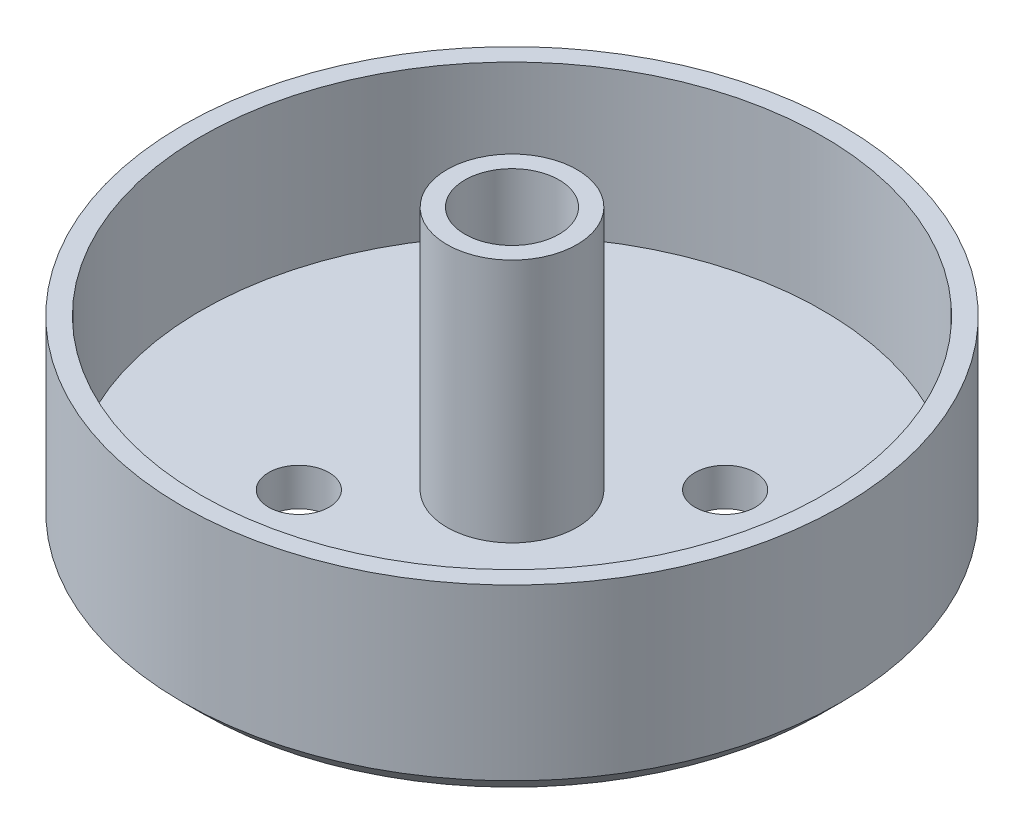
ISO-10303-21;
HEADER;
FILE_DESCRIPTION(('STEP AP214'),'2;1');
FILE_NAME('part.step','',(''),(''),'','','');
FILE_SCHEMA(('AUTOMOTIVE_DESIGN { 1 0 10303 214 1 1 1 1 }'));
ENDSEC;
DATA;
#1=APPLICATION_CONTEXT('core data for automotive mechanical design processes');
#2=APPLICATION_PROTOCOL_DEFINITION('international standard','automotive_design',2000,#1);
#3=PRODUCT_CONTEXT('',#1,'mechanical');
#4=PRODUCT('Part','Part','',(#3));
#5=PRODUCT_RELATED_PRODUCT_CATEGORY('part','',(#4));
#6=PRODUCT_DEFINITION_FORMATION('','',#4);
#7=PRODUCT_DEFINITION_CONTEXT('part definition',#1,'design');
#8=PRODUCT_DEFINITION('design','',#6,#7);
#9=PRODUCT_DEFINITION_SHAPE('','',#8);
#10=(LENGTH_UNIT() NAMED_UNIT(*) SI_UNIT(.MILLI.,.METRE.));
#11=(NAMED_UNIT(*) PLANE_ANGLE_UNIT() SI_UNIT($,.RADIAN.));
#12=(NAMED_UNIT(*) SI_UNIT($,.STERADIAN.) SOLID_ANGLE_UNIT());
#13=UNCERTAINTY_MEASURE_WITH_UNIT(LENGTH_MEASURE(1.E-05),#10,'distance_accuracy_value','');
#14=(GEOMETRIC_REPRESENTATION_CONTEXT(3) GLOBAL_UNCERTAINTY_ASSIGNED_CONTEXT((#13)) GLOBAL_UNIT_ASSIGNED_CONTEXT((#10,
#11,#12)) REPRESENTATION_CONTEXT('',''));
#15=CARTESIAN_POINT('',(0.,0.,0.));
#16=DIRECTION('',(0.,0.,1.));
#17=DIRECTION('',(1.,0.,0.));
#18=AXIS2_PLACEMENT_3D('',#15,#16,#17);
#19=CARTESIAN_POINT('',(0.,2.,0.));
#20=DIRECTION('',(0.,1.,0.));
#21=DIRECTION('',(0.,0.,1.));
#22=AXIS2_PLACEMENT_3D('',#19,#20,#21);
#23=PLANE('',#22);
#24=CARTESIAN_POINT('',(-5.6568542494924,2.,-5.65685424949235));
#25=DIRECTION('',(0.,1.,0.));
#26=DIRECTION('',(0.,0.,1.));
#27=AXIS2_PLACEMENT_3D('',#24,#25,#26);
#28=CIRCLE('',#27,1.6);
#29=CARTESIAN_POINT('',(-5.6568542494924,2.,-4.05685424949235));
#30=VERTEX_POINT('',#29);
#31=EDGE_CURVE('E77',#30,#30,#28,.T.);
#32=ORIENTED_EDGE('',*,*,#31,.F.);
#33=EDGE_LOOP('',(#32));
#34=FACE_BOUND('',#33,.T.);
#35=CARTESIAN_POINT('',(5.65685424949235,2.,-5.65685424949241));
#36=DIRECTION('',(0.,1.,0.));
#37=DIRECTION('',(0.,0.,1.));
#38=AXIS2_PLACEMENT_3D('',#35,#36,#37);
#39=CIRCLE('',#38,1.6);
#40=CARTESIAN_POINT('',(5.65685424949235,2.,-4.05685424949241));
#41=VERTEX_POINT('',#40);
#42=EDGE_CURVE('E82',#41,#41,#39,.T.);
#43=ORIENTED_EDGE('',*,*,#42,.F.);
#44=EDGE_LOOP('',(#43));
#45=FACE_BOUND('',#44,.T.);
#46=CARTESIAN_POINT('',(5.65685424949241,2.,5.65685424949235));
#47=DIRECTION('',(0.,1.,0.));
#48=DIRECTION('',(0.,0.,1.));
#49=AXIS2_PLACEMENT_3D('',#46,#47,#48);
#50=CIRCLE('',#49,1.6);
#51=CARTESIAN_POINT('',(5.65685424949241,2.,7.25685424949235));
#52=VERTEX_POINT('',#51);
#53=EDGE_CURVE('E85',#52,#52,#50,.T.);
#54=ORIENTED_EDGE('',*,*,#53,.F.);
#55=EDGE_LOOP('',(#54));
#56=FACE_BOUND('',#55,.T.);
#57=CARTESIAN_POINT('',(-5.65685424949235,2.,5.65685424949241));
#58=DIRECTION('',(0.,1.,0.));
#59=DIRECTION('',(0.,0.,1.));
#60=AXIS2_PLACEMENT_3D('',#57,#58,#59);
#61=CIRCLE('',#60,1.6);
#62=CARTESIAN_POINT('',(-5.65685424949235,2.,7.25685424949241));
#63=VERTEX_POINT('',#62);
#64=EDGE_CURVE('E88',#63,#63,#61,.T.);
#65=ORIENTED_EDGE('',*,*,#64,.F.);
#66=EDGE_LOOP('',(#65));
#67=FACE_BOUND('',#66,.T.);
#68=CARTESIAN_POINT('',(0.,2.,0.));
#69=DIRECTION('',(0.,1.,0.));
#70=DIRECTION('',(0.,0.,1.));
#71=AXIS2_PLACEMENT_3D('',#68,#69,#70);
#72=CIRCLE('',#71,3.45);
#73=CARTESIAN_POINT('',(0.,2.,3.45));
#74=VERTEX_POINT('',#73);
#75=EDGE_CURVE('E68',#74,#74,#72,.T.);
#76=ORIENTED_EDGE('',*,*,#75,.F.);
#77=EDGE_LOOP('',(#76));
#78=FACE_BOUND('',#77,.T.);
#79=CARTESIAN_POINT('',(0.,2.,0.));
#80=DIRECTION('',(0.,1.,0.));
#81=DIRECTION('',(0.,0.,1.));
#82=AXIS2_PLACEMENT_3D('',#79,#80,#81);
#83=CIRCLE('',#82,16.5);
#84=CARTESIAN_POINT('',(0.,2.,16.5));
#85=VERTEX_POINT('',#84);
#86=EDGE_CURVE('E55',#85,#85,#83,.F.);
#87=ORIENTED_EDGE('',*,*,#86,.F.);
#88=EDGE_LOOP('',(#87));
#89=FACE_BOUND('',#88,.T.);
#90=ADVANCED_FACE('F43',(#34,#45,#56,#67,#78,#89),#23,.T.);
#91=CARTESIAN_POINT('',(0.,0.,0.));
#92=DIRECTION('',(0.,1.,0.));
#93=DIRECTION('',(0.,0.,1.));
#94=AXIS2_PLACEMENT_3D('',#91,#92,#93);
#95=PLANE('',#94);
#96=CARTESIAN_POINT('',(0.,0.,0.));
#97=DIRECTION('',(0.,1.,0.));
#98=DIRECTION('',(0.,0.,1.));
#99=AXIS2_PLACEMENT_3D('',#96,#97,#98);
#100=CIRCLE('',#99,16.5);
#101=CARTESIAN_POINT('',(0.,0.,16.5));
#102=VERTEX_POINT('',#101);
#103=EDGE_CURVE('E11',#102,#102,#100,.F.);
#104=ORIENTED_EDGE('',*,*,#103,.T.);
#105=EDGE_LOOP('',(#104));
#106=FACE_BOUND('',#105,.T.);
#107=CARTESIAN_POINT('',(-5.6568542494924,0.,-5.65685424949235));
#108=DIRECTION('',(0.,-1.,0.));
#109=DIRECTION('',(0.,0.,-1.));
#110=AXIS2_PLACEMENT_3D('',#107,#108,#109);
#111=CIRCLE('',#110,1.6);
#112=CARTESIAN_POINT('',(-5.6568542494924,0.,-7.25685424949235));
#113=VERTEX_POINT('',#112);
#114=EDGE_CURVE('E95',#113,#113,#111,.T.);
#115=ORIENTED_EDGE('',*,*,#114,.F.);
#116=EDGE_LOOP('',(#115));
#117=FACE_BOUND('',#116,.T.);
#118=CARTESIAN_POINT('',(5.65685424949235,0.,-5.65685424949241));
#119=DIRECTION('',(0.,-1.,0.));
#120=DIRECTION('',(0.,0.,-1.));
#121=AXIS2_PLACEMENT_3D('',#118,#119,#120);
#122=CIRCLE('',#121,1.6);
#123=CARTESIAN_POINT('',(5.65685424949235,0.,-7.25685424949241));
#124=VERTEX_POINT('',#123);
#125=EDGE_CURVE('E98',#124,#124,#122,.T.);
#126=ORIENTED_EDGE('',*,*,#125,.F.);
#127=EDGE_LOOP('',(#126));
#128=FACE_BOUND('',#127,.T.);
#129=CARTESIAN_POINT('',(5.65685424949241,0.,5.65685424949235));
#130=DIRECTION('',(0.,-1.,0.));
#131=DIRECTION('',(0.,0.,-1.));
#132=AXIS2_PLACEMENT_3D('',#129,#130,#131);
#133=CIRCLE('',#132,1.6);
#134=CARTESIAN_POINT('',(5.65685424949241,0.,4.05685424949235));
#135=VERTEX_POINT('',#134);
#136=EDGE_CURVE('E94',#135,#135,#133,.T.);
#137=ORIENTED_EDGE('',*,*,#136,.F.);
#138=EDGE_LOOP('',(#137));
#139=FACE_BOUND('',#138,.T.);
#140=CARTESIAN_POINT('',(-5.65685424949235,0.,5.65685424949241));
#141=DIRECTION('',(0.,-1.,0.));
#142=DIRECTION('',(0.,0.,-1.));
#143=AXIS2_PLACEMENT_3D('',#140,#141,#142);
#144=CIRCLE('',#143,1.6);
#145=CARTESIAN_POINT('',(-5.65685424949235,0.,4.05685424949241));
#146=VERTEX_POINT('',#145);
#147=EDGE_CURVE('E91',#146,#146,#144,.T.);
#148=ORIENTED_EDGE('',*,*,#147,.F.);
#149=EDGE_LOOP('',(#148));
#150=FACE_BOUND('',#149,.T.);
#151=CARTESIAN_POINT('',(0.,0.,0.));
#152=DIRECTION('',(0.,1.,0.));
#153=DIRECTION('',(0.,0.,1.));
#154=AXIS2_PLACEMENT_3D('',#151,#152,#153);
#155=CIRCLE('',#154,2.5);
#156=CARTESIAN_POINT('',(0.,0.,2.5));
#157=VERTEX_POINT('',#156);
#158=EDGE_CURVE('E59',#157,#157,#155,.T.);
#159=ORIENTED_EDGE('',*,*,#158,.T.);
#160=EDGE_LOOP('',(#159));
#161=FACE_BOUND('',#160,.T.);
#162=ADVANCED_FACE('F106',(#106,#117,#128,#139,#150,#161),#95,.F.);
#163=CARTESIAN_POINT('',(0.,2.,0.));
#164=DIRECTION('',(0.,-1.,0.));
#165=DIRECTION('',(0.,0.,-1.));
#166=AXIS2_PLACEMENT_3D('',#163,#164,#165);
#167=CYLINDRICAL_SURFACE('',#166,17.5);
#168=CARTESIAN_POINT('',(0.,1.00000000000001,0.));
#169=DIRECTION('',(0.,1.,0.));
#170=DIRECTION('',(0.,0.,1.));
#171=AXIS2_PLACEMENT_3D('',#168,#169,#170);
#172=CIRCLE('',#171,17.5);
#173=CARTESIAN_POINT('',(0.,1.00000000000001,17.5));
#174=VERTEX_POINT('',#173);
#175=EDGE_CURVE('E51',#174,#174,#172,.T.);
#176=ORIENTED_EDGE('',*,*,#175,.T.);
#177=EDGE_LOOP('',(#176));
#178=FACE_BOUND('',#177,.T.);
#179=CARTESIAN_POINT('',(0.,10.,0.));
#180=DIRECTION('',(0.,1.,0.));
#181=DIRECTION('',(0.,0.,1.));
#182=AXIS2_PLACEMENT_3D('',#179,#180,#181);
#183=CIRCLE('',#182,17.5);
#184=CARTESIAN_POINT('',(0.,10.,17.5));
#185=VERTEX_POINT('',#184);
#186=EDGE_CURVE('E69',#185,#185,#183,.T.);
#187=ORIENTED_EDGE('',*,*,#186,.F.);
#188=EDGE_LOOP('',(#187));
#189=FACE_BOUND('',#188,.T.);
#190=ADVANCED_FACE('F109',(#178,#189),#167,.T.);
#191=CARTESIAN_POINT('',(0.,2.,0.));
#192=DIRECTION('',(0.,-1.,0.));
#193=DIRECTION('',(0.,0.,-1.));
#194=AXIS2_PLACEMENT_3D('',#191,#192,#193);
#195=CYLINDRICAL_SURFACE('',#194,2.5);
#196=ORIENTED_EDGE('',*,*,#158,.F.);
#197=EDGE_LOOP('',(#196));
#198=FACE_BOUND('',#197,.T.);
#199=CARTESIAN_POINT('',(0.,15.,0.));
#200=DIRECTION('',(0.,1.,0.));
#201=DIRECTION('',(0.,0.,1.));
#202=AXIS2_PLACEMENT_3D('',#199,#200,#201);
#203=CIRCLE('',#202,2.5);
#204=CARTESIAN_POINT('',(0.,15.,2.5));
#205=VERTEX_POINT('',#204);
#206=EDGE_CURVE('E65',#205,#205,#203,.T.);
#207=ORIENTED_EDGE('',*,*,#206,.T.);
#208=EDGE_LOOP('',(#207));
#209=FACE_BOUND('',#208,.T.);
#210=ADVANCED_FACE('F115',(#198,#209),#195,.F.);
#211=CARTESIAN_POINT('',(0.,39.7580735803744,0.));
#212=DIRECTION('',(0.,-1.,0.));
#213=DIRECTION('',(0.,0.,-1.));
#214=AXIS2_PLACEMENT_3D('',#211,#212,#213);
#215=CYLINDRICAL_SURFACE('',#214,3.45);
#216=ORIENTED_EDGE('',*,*,#75,.T.);
#217=EDGE_LOOP('',(#216));
#218=FACE_BOUND('',#217,.T.);
#219=CARTESIAN_POINT('',(0.,15.,0.));
#220=DIRECTION('',(0.,1.,0.));
#221=DIRECTION('',(0.,0.,1.));
#222=AXIS2_PLACEMENT_3D('',#219,#220,#221);
#223=CIRCLE('',#222,3.45);
#224=CARTESIAN_POINT('',(0.,15.,3.45));
#225=VERTEX_POINT('',#224);
#226=EDGE_CURVE('E64',#225,#225,#223,.T.);
#227=ORIENTED_EDGE('',*,*,#226,.F.);
#228=EDGE_LOOP('',(#227));
#229=FACE_BOUND('',#228,.T.);
#230=ADVANCED_FACE('F118',(#218,#229),#215,.T.);
#231=CARTESIAN_POINT('',(0.,15.,0.));
#232=DIRECTION('',(0.,1.,0.));
#233=DIRECTION('',(0.,0.,1.));
#234=AXIS2_PLACEMENT_3D('',#231,#232,#233);
#235=PLANE('',#234);
#236=ORIENTED_EDGE('',*,*,#206,.F.);
#237=EDGE_LOOP('',(#236));
#238=FACE_BOUND('',#237,.T.);
#239=ORIENTED_EDGE('',*,*,#226,.T.);
#240=EDGE_LOOP('',(#239));
#241=FACE_BOUND('',#240,.T.);
#242=ADVANCED_FACE('F122',(#238,#241),#235,.T.);
#243=CARTESIAN_POINT('',(0.,69.4974746830583,0.));
#244=DIRECTION('',(0.,-1.,0.));
#245=DIRECTION('',(0.,0.,-1.));
#246=AXIS2_PLACEMENT_3D('',#243,#244,#245);
#247=CYLINDRICAL_SURFACE('',#246,16.5);
#248=ORIENTED_EDGE('',*,*,#86,.T.);
#249=EDGE_LOOP('',(#248));
#250=FACE_BOUND('',#249,.T.);
#251=CARTESIAN_POINT('',(0.,10.,0.));
#252=DIRECTION('',(0.,1.,0.));
#253=DIRECTION('',(0.,0.,1.));
#254=AXIS2_PLACEMENT_3D('',#251,#252,#253);
#255=CIRCLE('',#254,16.5);
#256=CARTESIAN_POINT('',(0.,10.,16.5));
#257=VERTEX_POINT('',#256);
#258=EDGE_CURVE('E74',#257,#257,#255,.T.);
#259=ORIENTED_EDGE('',*,*,#258,.T.);
#260=EDGE_LOOP('',(#259));
#261=FACE_BOUND('',#260,.T.);
#262=ADVANCED_FACE('F125',(#250,#261),#247,.F.);
#263=CARTESIAN_POINT('',(0.,10.,0.));
#264=DIRECTION('',(0.,1.,0.));
#265=DIRECTION('',(0.,0.,1.));
#266=AXIS2_PLACEMENT_3D('',#263,#264,#265);
#267=PLANE('',#266);
#268=ORIENTED_EDGE('',*,*,#258,.F.);
#269=EDGE_LOOP('',(#268));
#270=FACE_BOUND('',#269,.T.);
#271=ORIENTED_EDGE('',*,*,#186,.T.);
#272=EDGE_LOOP('',(#271));
#273=FACE_BOUND('',#272,.T.);
#274=ADVANCED_FACE('F150',(#270,#273),#267,.T.);
#275=CARTESIAN_POINT('',(-5.65685424949235,3.,5.65685424949241));
#276=DIRECTION('',(0.,-1.,0.));
#277=DIRECTION('',(0.,0.,-1.));
#278=AXIS2_PLACEMENT_3D('',#275,#276,#277);
#279=CYLINDRICAL_SURFACE('',#278,1.6);
#280=ORIENTED_EDGE('',*,*,#64,.T.);
#281=EDGE_LOOP('',(#280));
#282=FACE_BOUND('',#281,.T.);
#283=ORIENTED_EDGE('',*,*,#147,.T.);
#284=EDGE_LOOP('',(#283));
#285=FACE_BOUND('',#284,.T.);
#286=ADVANCED_FACE('F151',(#282,#285),#279,.F.);
#287=CARTESIAN_POINT('',(5.65685424949241,3.,5.65685424949235));
#288=DIRECTION('',(0.,-1.,0.));
#289=DIRECTION('',(0.,0.,-1.));
#290=AXIS2_PLACEMENT_3D('',#287,#288,#289);
#291=CYLINDRICAL_SURFACE('',#290,1.6);
#292=ORIENTED_EDGE('',*,*,#53,.T.);
#293=EDGE_LOOP('',(#292));
#294=FACE_BOUND('',#293,.T.);
#295=ORIENTED_EDGE('',*,*,#136,.T.);
#296=EDGE_LOOP('',(#295));
#297=FACE_BOUND('',#296,.T.);
#298=ADVANCED_FACE('F104',(#294,#297),#291,.F.);
#299=CARTESIAN_POINT('',(5.65685424949235,3.,-5.65685424949241));
#300=DIRECTION('',(0.,-1.,0.));
#301=DIRECTION('',(0.,0.,-1.));
#302=AXIS2_PLACEMENT_3D('',#299,#300,#301);
#303=CYLINDRICAL_SURFACE('',#302,1.6);
#304=ORIENTED_EDGE('',*,*,#42,.T.);
#305=EDGE_LOOP('',(#304));
#306=FACE_BOUND('',#305,.T.);
#307=ORIENTED_EDGE('',*,*,#125,.T.);
#308=EDGE_LOOP('',(#307));
#309=FACE_BOUND('',#308,.T.);
#310=ADVANCED_FACE('F166',(#306,#309),#303,.F.);
#311=CARTESIAN_POINT('',(-5.6568542494924,3.,-5.65685424949235));
#312=DIRECTION('',(0.,-1.,0.));
#313=DIRECTION('',(0.,0.,-1.));
#314=AXIS2_PLACEMENT_3D('',#311,#312,#313);
#315=CYLINDRICAL_SURFACE('',#314,1.6);
#316=ORIENTED_EDGE('',*,*,#31,.T.);
#317=EDGE_LOOP('',(#316));
#318=FACE_BOUND('',#317,.T.);
#319=ORIENTED_EDGE('',*,*,#114,.T.);
#320=EDGE_LOOP('',(#319));
#321=FACE_BOUND('',#320,.T.);
#322=ADVANCED_FACE('F163',(#318,#321),#315,.F.);
#323=CARTESIAN_POINT('',(0.,1.00000000000001,0.));
#324=DIRECTION('',(0.,1.,0.));
#325=DIRECTION('',(0.,0.,1.));
#326=AXIS2_PLACEMENT_3D('',#323,#324,#325);
#327=CONICAL_SURFACE('',#326,17.5,0.785398163397448);
#328=ORIENTED_EDGE('',*,*,#103,.F.);
#329=EDGE_LOOP('',(#328));
#330=FACE_BOUND('',#329,.T.);
#331=ORIENTED_EDGE('',*,*,#175,.F.);
#332=EDGE_LOOP('',(#331));
#333=FACE_BOUND('',#332,.T.);
#334=ADVANCED_FACE('F46',(#330,#333),#327,.T.);
#335=CLOSED_SHELL('',(#90,#162,#190,#210,#230,#242,#262,#274,#286,#298,#310,#322,#334));
#336=MANIFOLD_SOLID_BREP('B2',#335);
#337=ADVANCED_BREP_SHAPE_REPRESENTATION('',(#18,#336),#14);
#338=SHAPE_DEFINITION_REPRESENTATION(#9,#337);
ENDSEC;
END-ISO-10303-21;
